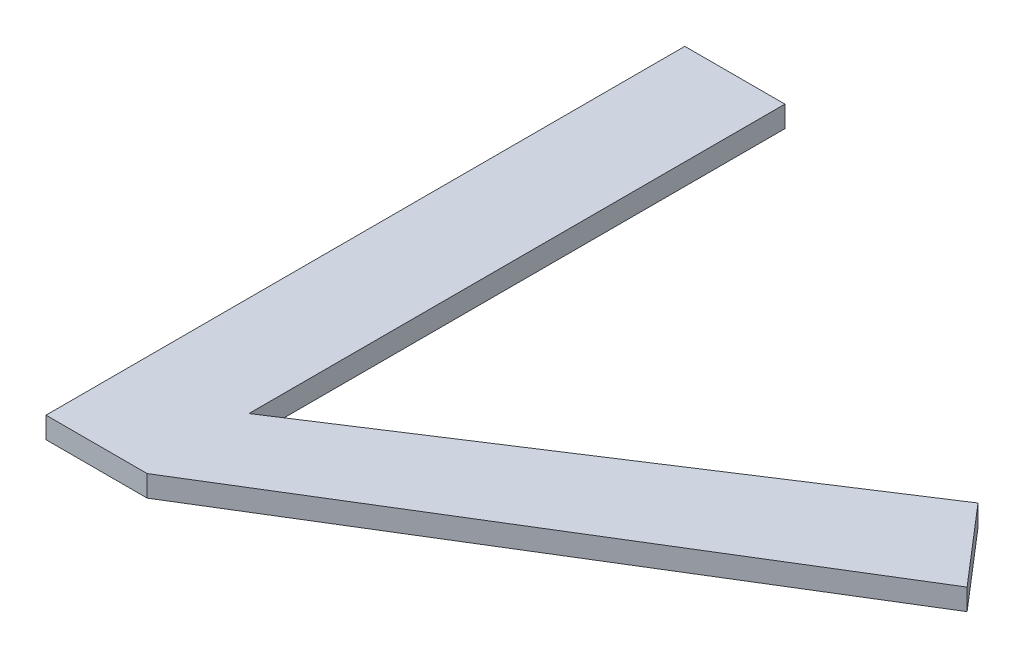
ISO-10303-21;
HEADER;
FILE_DESCRIPTION(('STEP AP214'),'2;1');
FILE_NAME('part.step','',(''),(''),'','','');
FILE_SCHEMA(('AUTOMOTIVE_DESIGN { 1 0 10303 214 1 1 1 1 }'));
ENDSEC;
DATA;
#1=APPLICATION_CONTEXT('core data for automotive mechanical design processes');
#2=APPLICATION_PROTOCOL_DEFINITION('international standard','automotive_design',2000,#1);
#3=PRODUCT_CONTEXT('',#1,'mechanical');
#4=PRODUCT('Part','Part','',(#3));
#5=PRODUCT_RELATED_PRODUCT_CATEGORY('part','',(#4));
#6=PRODUCT_DEFINITION_FORMATION('','',#4);
#7=PRODUCT_DEFINITION_CONTEXT('part definition',#1,'design');
#8=PRODUCT_DEFINITION('design','',#6,#7);
#9=PRODUCT_DEFINITION_SHAPE('','',#8);
#10=(LENGTH_UNIT() NAMED_UNIT(*) SI_UNIT(.MILLI.,.METRE.));
#11=(NAMED_UNIT(*) PLANE_ANGLE_UNIT() SI_UNIT($,.RADIAN.));
#12=(NAMED_UNIT(*) SI_UNIT($,.STERADIAN.) SOLID_ANGLE_UNIT());
#13=UNCERTAINTY_MEASURE_WITH_UNIT(LENGTH_MEASURE(1.E-05),#10,'distance_accuracy_value','');
#14=(GEOMETRIC_REPRESENTATION_CONTEXT(3) GLOBAL_UNCERTAINTY_ASSIGNED_CONTEXT((#13)) GLOBAL_UNIT_ASSIGNED_CONTEXT((#10,
#11,#12)) REPRESENTATION_CONTEXT('',''));
#15=CARTESIAN_POINT('',(0.,0.,0.));
#16=DIRECTION('',(0.,0.,1.));
#17=DIRECTION('',(1.,0.,0.));
#18=AXIS2_PLACEMENT_3D('',#15,#16,#17);
#19=CARTESIAN_POINT('',(20.7570965566492,1.,-13.479816116622));
#20=DIRECTION('',(0.544639035015032,0.,0.838670567945421));
#21=DIRECTION('',(0.838670567945421,0.,-0.544639035015032));
#22=AXIS2_PLACEMENT_3D('',#19,#20,#21);
#23=PLANE('',#22);
#24=DIRECTION('',(-0.838670567945421,0.,0.544639035015032));
#25=VECTOR('',#24,1.);
#26=CARTESIAN_POINT('',(20.7570965566492,0.,-13.479816116622));
#27=LINE('',#26,#25);
#28=CARTESIAN_POINT('',(20.7570965566492,0.,-13.479816116622));
#29=VERTEX_POINT('',#28);
#30=CARTESIAN_POINT('',(0.,0.,0.));
#31=VERTEX_POINT('',#30);
#32=EDGE_CURVE('E134',#29,#31,#27,.T.);
#33=ORIENTED_EDGE('',*,*,#32,.T.);
#34=DIRECTION('',(0.,-1.,0.));
#35=VECTOR('',#34,1.);
#36=CARTESIAN_POINT('',(0.,1.,0.));
#37=LINE('',#36,#35);
#38=CARTESIAN_POINT('',(0.,1.,0.));
#39=VERTEX_POINT('',#38);
#40=EDGE_CURVE('E11',#39,#31,#37,.T.);
#41=ORIENTED_EDGE('',*,*,#40,.F.);
#42=DIRECTION('',(-0.838670567945421,0.,0.544639035015032));
#43=VECTOR('',#42,1.);
#44=CARTESIAN_POINT('',(20.7570965566492,1.,-13.479816116622));
#45=LINE('',#44,#43);
#46=CARTESIAN_POINT('',(20.7570965566492,1.,-13.479816116622));
#47=VERTEX_POINT('',#46);
#48=EDGE_CURVE('E153',#47,#39,#45,.T.);
#49=ORIENTED_EDGE('',*,*,#48,.F.);
#50=DIRECTION('',(0.,-1.,0.));
#51=VECTOR('',#50,1.);
#52=CARTESIAN_POINT('',(20.7570965566492,1.,-13.479816116622));
#53=LINE('',#52,#51);
#54=EDGE_CURVE('E130',#47,#29,#53,.T.);
#55=ORIENTED_EDGE('',*,*,#54,.T.);
#56=EDGE_LOOP('',(#33,#41,#49,#55));
#57=FACE_BOUND('',#56,.T.);
#58=ADVANCED_FACE('F39',(#57),#23,.F.);
#59=CARTESIAN_POINT('',(0.,1.,0.));
#60=DIRECTION('',(-1.,0.,0.));
#61=DIRECTION('',(0.,0.,1.));
#62=AXIS2_PLACEMENT_3D('',#59,#60,#61);
#63=PLANE('',#62);
#64=DIRECTION('',(0.,0.,-1.));
#65=VECTOR('',#64,1.);
#66=CARTESIAN_POINT('',(0.,0.,0.));
#67=LINE('',#66,#65);
#68=CARTESIAN_POINT('',(0.,0.,-25.1686799028641));
#69=VERTEX_POINT('',#68);
#70=EDGE_CURVE('E138',#31,#69,#67,.T.);
#71=ORIENTED_EDGE('',*,*,#70,.T.);
#72=DIRECTION('',(0.,-1.,0.));
#73=VECTOR('',#72,1.);
#74=CARTESIAN_POINT('',(0.,1.,-25.1686799028641));
#75=LINE('',#74,#73);
#76=CARTESIAN_POINT('',(0.,1.,-25.1686799028641));
#77=VERTEX_POINT('',#76);
#78=EDGE_CURVE('E48',#77,#69,#75,.T.);
#79=ORIENTED_EDGE('',*,*,#78,.F.);
#80=DIRECTION('',(0.,0.,-1.));
#81=VECTOR('',#80,1.);
#82=CARTESIAN_POINT('',(0.,1.,0.));
#83=LINE('',#82,#81);
#84=EDGE_CURVE('E96',#39,#77,#83,.T.);
#85=ORIENTED_EDGE('',*,*,#84,.F.);
#86=ORIENTED_EDGE('',*,*,#40,.T.);
#87=EDGE_LOOP('',(#71,#79,#85,#86));
#88=FACE_BOUND('',#87,.T.);
#89=ADVANCED_FACE('F187',(#88),#63,.F.);
#90=CARTESIAN_POINT('',(0.,1.,-25.1686799028641));
#91=DIRECTION('',(0.,0.,1.));
#92=DIRECTION('',(1.,0.,0.));
#93=AXIS2_PLACEMENT_3D('',#90,#91,#92);
#94=PLANE('',#93);
#95=DIRECTION('',(-1.,0.,0.));
#96=VECTOR('',#95,1.);
#97=CARTESIAN_POINT('',(0.,0.,-25.1686799028641));
#98=LINE('',#97,#96);
#99=CARTESIAN_POINT('',(-4.7,0.,-25.1686799028641));
#100=VERTEX_POINT('',#99);
#101=EDGE_CURVE('E141',#69,#100,#98,.T.);
#102=ORIENTED_EDGE('',*,*,#101,.T.);
#103=DIRECTION('',(0.,-1.,0.));
#104=VECTOR('',#103,1.);
#105=CARTESIAN_POINT('',(-4.7,1.,-25.1686799028641));
#106=LINE('',#105,#104);
#107=CARTESIAN_POINT('',(-4.7,1.,-25.1686799028641));
#108=VERTEX_POINT('',#107);
#109=EDGE_CURVE('E160',#108,#100,#106,.T.);
#110=ORIENTED_EDGE('',*,*,#109,.F.);
#111=DIRECTION('',(-1.,0.,0.));
#112=VECTOR('',#111,1.);
#113=CARTESIAN_POINT('',(0.,1.,-25.1686799028641));
#114=LINE('',#113,#112);
#115=EDGE_CURVE('E170',#77,#108,#114,.T.);
#116=ORIENTED_EDGE('',*,*,#115,.F.);
#117=ORIENTED_EDGE('',*,*,#78,.T.);
#118=EDGE_LOOP('',(#102,#110,#116,#117));
#119=FACE_BOUND('',#118,.T.);
#120=ADVANCED_FACE('F168',(#119),#94,.F.);
#121=CARTESIAN_POINT('',(-4.7,1.,-25.1686799028641));
#122=DIRECTION('',(1.,0.,0.));
#123=DIRECTION('',(0.,0.,-1.));
#124=AXIS2_PLACEMENT_3D('',#121,#122,#123);
#125=PLANE('',#124);
#126=DIRECTION('',(0.,0.,1.));
#127=VECTOR('',#126,1.);
#128=CARTESIAN_POINT('',(-4.7,0.,-25.1686799028641));
#129=LINE('',#128,#127);
#130=CARTESIAN_POINT('',(-4.7,0.,4.83132009713591));
#131=VERTEX_POINT('',#130);
#132=EDGE_CURVE('E144',#100,#131,#129,.T.);
#133=ORIENTED_EDGE('',*,*,#132,.T.);
#134=DIRECTION('',(0.,-1.,0.));
#135=VECTOR('',#134,1.);
#136=CARTESIAN_POINT('',(-4.7,1.,4.83132009713591));
#137=LINE('',#136,#135);
#138=CARTESIAN_POINT('',(-4.7,1.,4.83132009713591));
#139=VERTEX_POINT('',#138);
#140=EDGE_CURVE('E123',#139,#131,#137,.T.);
#141=ORIENTED_EDGE('',*,*,#140,.F.);
#142=DIRECTION('',(0.,0.,1.));
#143=VECTOR('',#142,1.);
#144=CARTESIAN_POINT('',(-4.7,1.,-25.1686799028641));
#145=LINE('',#144,#143);
#146=EDGE_CURVE('E112',#108,#139,#145,.T.);
#147=ORIENTED_EDGE('',*,*,#146,.F.);
#148=ORIENTED_EDGE('',*,*,#109,.T.);
#149=EDGE_LOOP('',(#133,#141,#147,#148));
#150=FACE_BOUND('',#149,.T.);
#151=ADVANCED_FACE('F176',(#150),#125,.F.);
#152=CARTESIAN_POINT('',(-4.7,1.,4.83132009713591));
#153=DIRECTION('',(0.,0.,-1.));
#154=DIRECTION('',(-1.,0.,0.));
#155=AXIS2_PLACEMENT_3D('',#152,#153,#154);
#156=PLANE('',#155);
#157=DIRECTION('',(1.,0.,0.));
#158=VECTOR('',#157,1.);
#159=CARTESIAN_POINT('',(-4.7,0.,4.83132009713591));
#160=LINE('',#159,#158);
#161=CARTESIAN_POINT('',(0.0500000000000002,0.,4.83132009713592));
#162=VERTEX_POINT('',#161);
#163=EDGE_CURVE('E121',#131,#162,#160,.T.);
#164=ORIENTED_EDGE('',*,*,#163,.T.);
#165=DIRECTION('',(0.,-1.,0.));
#166=VECTOR('',#165,1.);
#167=CARTESIAN_POINT('',(0.0500000000000002,1.,4.83132009713592));
#168=LINE('',#167,#166);
#169=CARTESIAN_POINT('',(0.0500000000000002,1.,4.83132009713592));
#170=VERTEX_POINT('',#169);
#171=EDGE_CURVE('E118',#170,#162,#168,.T.);
#172=ORIENTED_EDGE('',*,*,#171,.F.);
#173=DIRECTION('',(1.,0.,0.));
#174=VECTOR('',#173,1.);
#175=CARTESIAN_POINT('',(-4.7,1.,4.83132009713591));
#176=LINE('',#175,#174);
#177=EDGE_CURVE('E106',#139,#170,#176,.T.);
#178=ORIENTED_EDGE('',*,*,#177,.F.);
#179=ORIENTED_EDGE('',*,*,#140,.T.);
#180=EDGE_LOOP('',(#164,#172,#178,#179));
#181=FACE_BOUND('',#180,.T.);
#182=ADVANCED_FACE('F119',(#181),#156,.F.);
#183=CARTESIAN_POINT('',(0.0500000000000002,1.,4.83132009713592));
#184=DIRECTION('',(-0.522680860622332,0.,-0.852528426469815));
#185=DIRECTION('',(-0.852528426469815,0.,0.522680860622332));
#186=AXIS2_PLACEMENT_3D('',#183,#184,#185);
#187=PLANE('',#186);
#188=DIRECTION('',(0.852528426469815,0.,-0.522680860622331));
#189=VECTOR('',#188,1.);
#190=CARTESIAN_POINT('',(0.0500000000000002,0.,4.83132009713592));
#191=LINE('',#190,#189);
#192=CARTESIAN_POINT('',(23.9207959411548,0.,-9.80374400028936));
#193=VERTEX_POINT('',#192);
#194=EDGE_CURVE('E82',#162,#193,#191,.T.);
#195=ORIENTED_EDGE('',*,*,#194,.T.);
#196=DIRECTION('',(0.,-1.,0.));
#197=VECTOR('',#196,1.);
#198=CARTESIAN_POINT('',(23.9207959411548,1.,-9.80374400028936));
#199=LINE('',#198,#197);
#200=CARTESIAN_POINT('',(23.9207959411548,1.,-9.80374400028936));
#201=VERTEX_POINT('',#200);
#202=EDGE_CURVE('E124',#201,#193,#199,.T.);
#203=ORIENTED_EDGE('',*,*,#202,.F.);
#204=DIRECTION('',(0.852528426469815,0.,-0.522680860622331));
#205=VECTOR('',#204,1.);
#206=CARTESIAN_POINT('',(0.0500000000000002,1.,4.83132009713592));
#207=LINE('',#206,#205);
#208=EDGE_CURVE('E110',#170,#201,#207,.T.);
#209=ORIENTED_EDGE('',*,*,#208,.F.);
#210=ORIENTED_EDGE('',*,*,#171,.T.);
#211=EDGE_LOOP('',(#195,#203,#209,#210));
#212=FACE_BOUND('',#211,.T.);
#213=ADVANCED_FACE('F126',(#212),#187,.F.);
#214=CARTESIAN_POINT('',(23.9207959411548,1.,-9.80374400028936));
#215=DIRECTION('',(-0.757953013676838,0.,0.652309151444465));
#216=DIRECTION('',(0.652309151444465,0.,0.757953013676838));
#217=AXIS2_PLACEMENT_3D('',#214,#215,#216);
#218=PLANE('',#217);
#219=DIRECTION('',(-0.652309151444465,0.,-0.757953013676838));
#220=VECTOR('',#219,1.);
#221=CARTESIAN_POINT('',(23.9207959411548,0.,-9.80374400028936));
#222=LINE('',#221,#220);
#223=EDGE_CURVE('E88',#193,#29,#222,.T.);
#224=ORIENTED_EDGE('',*,*,#223,.T.);
#225=ORIENTED_EDGE('',*,*,#54,.F.);
#226=DIRECTION('',(-0.652309151444465,0.,-0.757953013676838));
#227=VECTOR('',#226,1.);
#228=CARTESIAN_POINT('',(23.9207959411548,1.,-9.80374400028936));
#229=LINE('',#228,#227);
#230=EDGE_CURVE('E56',#201,#47,#229,.T.);
#231=ORIENTED_EDGE('',*,*,#230,.F.);
#232=ORIENTED_EDGE('',*,*,#202,.T.);
#233=EDGE_LOOP('',(#224,#225,#231,#232));
#234=FACE_BOUND('',#233,.T.);
#235=ADVANCED_FACE('F201',(#234),#218,.F.);
#236=CARTESIAN_POINT('',(0.,1.,0.));
#237=DIRECTION('',(0.,-1.,0.));
#238=DIRECTION('',(0.,0.,-1.));
#239=AXIS2_PLACEMENT_3D('',#236,#237,#238);
#240=PLANE('',#239);
#241=ORIENTED_EDGE('',*,*,#48,.T.);
#242=ORIENTED_EDGE('',*,*,#84,.T.);
#243=ORIENTED_EDGE('',*,*,#115,.T.);
#244=ORIENTED_EDGE('',*,*,#146,.T.);
#245=ORIENTED_EDGE('',*,*,#177,.T.);
#246=ORIENTED_EDGE('',*,*,#208,.T.);
#247=ORIENTED_EDGE('',*,*,#230,.T.);
#248=EDGE_LOOP('',(#241,#242,#243,#244,#245,#246,#247));
#249=FACE_BOUND('',#248,.T.);
#250=ADVANCED_FACE('F108',(#249),#240,.F.);
#251=CARTESIAN_POINT('',(0.,0.,0.));
#252=DIRECTION('',(0.,-1.,0.));
#253=DIRECTION('',(0.,0.,-1.));
#254=AXIS2_PLACEMENT_3D('',#251,#252,#253);
#255=PLANE('',#254);
#256=ORIENTED_EDGE('',*,*,#32,.F.);
#257=ORIENTED_EDGE('',*,*,#223,.F.);
#258=ORIENTED_EDGE('',*,*,#194,.F.);
#259=ORIENTED_EDGE('',*,*,#163,.F.);
#260=ORIENTED_EDGE('',*,*,#132,.F.);
#261=ORIENTED_EDGE('',*,*,#101,.F.);
#262=ORIENTED_EDGE('',*,*,#70,.F.);
#263=EDGE_LOOP('',(#256,#257,#258,#259,#260,#261,#262));
#264=FACE_BOUND('',#263,.T.);
#265=ADVANCED_FACE('F174',(#264),#255,.T.);
#266=CLOSED_SHELL('',(#58,#89,#120,#151,#182,#213,#235,#250,#265));
#267=MANIFOLD_SOLID_BREP('B2',#266);
#268=ADVANCED_BREP_SHAPE_REPRESENTATION('',(#18,#267),#14);
#269=SHAPE_DEFINITION_REPRESENTATION(#9,#268);
ENDSEC;
END-ISO-10303-21;
